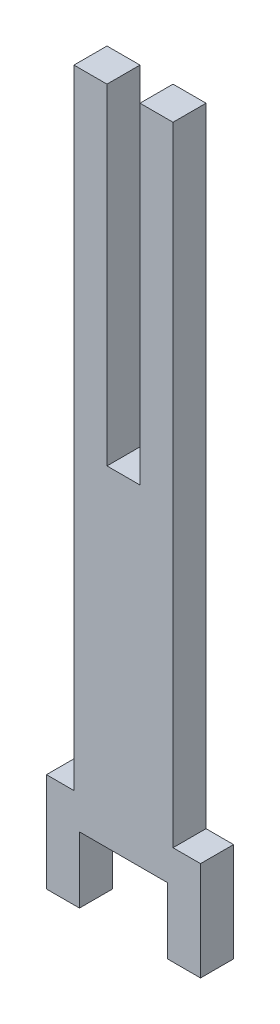
ISO-10303-21;
HEADER;
FILE_DESCRIPTION(('STEP AP214'),'2;1');
FILE_NAME('part.step','',(''),(''),'','','');
FILE_SCHEMA(('AUTOMOTIVE_DESIGN { 1 0 10303 214 1 1 1 1 }'));
ENDSEC;
DATA;
#1=APPLICATION_CONTEXT('core data for automotive mechanical design processes');
#2=APPLICATION_PROTOCOL_DEFINITION('international standard','automotive_design',2000,#1);
#3=PRODUCT_CONTEXT('',#1,'mechanical');
#4=PRODUCT('Part','Part','',(#3));
#5=PRODUCT_RELATED_PRODUCT_CATEGORY('part','',(#4));
#6=PRODUCT_DEFINITION_FORMATION('','',#4);
#7=PRODUCT_DEFINITION_CONTEXT('part definition',#1,'design');
#8=PRODUCT_DEFINITION('design','',#6,#7);
#9=PRODUCT_DEFINITION_SHAPE('','',#8);
#10=(LENGTH_UNIT() NAMED_UNIT(*) SI_UNIT(.MILLI.,.METRE.));
#11=(NAMED_UNIT(*) PLANE_ANGLE_UNIT() SI_UNIT($,.RADIAN.));
#12=(NAMED_UNIT(*) SI_UNIT($,.STERADIAN.) SOLID_ANGLE_UNIT());
#13=UNCERTAINTY_MEASURE_WITH_UNIT(LENGTH_MEASURE(1.E-05),#10,'distance_accuracy_value','');
#14=(GEOMETRIC_REPRESENTATION_CONTEXT(3) GLOBAL_UNCERTAINTY_ASSIGNED_CONTEXT((#13)) GLOBAL_UNIT_ASSIGNED_CONTEXT((#10,
#11,#12)) REPRESENTATION_CONTEXT('',''));
#15=CARTESIAN_POINT('',(0.,0.,0.));
#16=DIRECTION('',(0.,0.,1.));
#17=DIRECTION('',(1.,0.,0.));
#18=AXIS2_PLACEMENT_3D('',#15,#16,#17);
#19=CARTESIAN_POINT('',(0.,33.044,3.));
#20=DIRECTION('',(0.,1.,0.));
#21=DIRECTION('',(0.,0.,1.));
#22=AXIS2_PLACEMENT_3D('',#19,#20,#21);
#23=PLANE('',#22);
#24=DIRECTION('',(0.,0.,1.));
#25=VECTOR('',#24,1.);
#26=CARTESIAN_POINT('',(1.5,33.044,-30.1934088171574));
#27=LINE('',#26,#25);
#28=CARTESIAN_POINT('',(1.5,33.044,0.));
#29=VERTEX_POINT('',#28);
#30=CARTESIAN_POINT('',(1.5,33.044,3.));
#31=VERTEX_POINT('',#30);
#32=EDGE_CURVE('E245',#29,#31,#27,.T.);
#33=ORIENTED_EDGE('',*,*,#32,.T.);
#34=DIRECTION('',(1.,0.,0.));
#35=VECTOR('',#34,1.);
#36=CARTESIAN_POINT('',(0.,33.044,3.));
#37=LINE('',#36,#35);
#38=CARTESIAN_POINT('',(4.5,33.044,3.));
#39=VERTEX_POINT('',#38);
#40=EDGE_CURVE('E75',#31,#39,#37,.T.);
#41=ORIENTED_EDGE('',*,*,#40,.T.);
#42=DIRECTION('',(0.,0.,-1.));
#43=VECTOR('',#42,1.);
#44=CARTESIAN_POINT('',(4.5,33.044,3.));
#45=LINE('',#44,#43);
#46=CARTESIAN_POINT('',(4.5,33.044,0.));
#47=VERTEX_POINT('',#46);
#48=EDGE_CURVE('E191',#39,#47,#45,.T.);
#49=ORIENTED_EDGE('',*,*,#48,.T.);
#50=DIRECTION('',(1.,0.,0.));
#51=VECTOR('',#50,1.);
#52=CARTESIAN_POINT('',(0.,33.044,0.));
#53=LINE('',#52,#51);
#54=EDGE_CURVE('E121',#29,#47,#53,.T.);
#55=ORIENTED_EDGE('',*,*,#54,.F.);
#56=EDGE_LOOP('',(#33,#41,#49,#55));
#57=FACE_BOUND('',#56,.T.);
#58=ADVANCED_FACE('F50',(#57),#23,.T.);
#59=DIRECTION('',(0.,0.,1.));
#60=VECTOR('',#59,1.);
#61=CARTESIAN_POINT('',(-1.5,33.044,-30.1934088171574));
#62=LINE('',#61,#60);
#63=CARTESIAN_POINT('',(-1.5,33.044,0.));
#64=VERTEX_POINT('',#63);
#65=CARTESIAN_POINT('',(-1.5,33.044,3.));
#66=VERTEX_POINT('',#65);
#67=EDGE_CURVE('E249',#64,#66,#62,.T.);
#68=ORIENTED_EDGE('',*,*,#67,.F.);
#69=CARTESIAN_POINT('',(-4.5,33.044,0.));
#70=VERTEX_POINT('',#69);
#71=EDGE_CURVE('E292',#70,#64,#53,.T.);
#72=ORIENTED_EDGE('',*,*,#71,.F.);
#73=DIRECTION('',(0.,0.,-1.));
#74=VECTOR('',#73,1.);
#75=CARTESIAN_POINT('',(-4.5,33.044,3.));
#76=LINE('',#75,#74);
#77=CARTESIAN_POINT('',(-4.5,33.044,3.));
#78=VERTEX_POINT('',#77);
#79=EDGE_CURVE('E12',#78,#70,#76,.T.);
#80=ORIENTED_EDGE('',*,*,#79,.F.);
#81=EDGE_CURVE('E241',#78,#66,#37,.T.);
#82=ORIENTED_EDGE('',*,*,#81,.T.);
#83=EDGE_LOOP('',(#68,#72,#80,#82));
#84=FACE_BOUND('',#83,.T.);
#85=ADVANCED_FACE('F52',(#84),#23,.T.);
#86=CARTESIAN_POINT('',(-4.5,0.,3.));
#87=DIRECTION('',(-1.,0.,0.));
#88=DIRECTION('',(0.,0.,1.));
#89=AXIS2_PLACEMENT_3D('',#86,#87,#88);
#90=PLANE('',#89);
#91=DIRECTION('',(0.,1.,0.));
#92=VECTOR('',#91,1.);
#93=CARTESIAN_POINT('',(-4.5,0.,0.));
#94=LINE('',#93,#92);
#95=CARTESIAN_POINT('',(-4.5,-24.044,0.));
#96=VERTEX_POINT('',#95);
#97=EDGE_CURVE('E297',#96,#70,#94,.T.);
#98=ORIENTED_EDGE('',*,*,#97,.F.);
#99=DIRECTION('',(0.,0.,-1.));
#100=VECTOR('',#99,1.);
#101=CARTESIAN_POINT('',(-4.5,-24.044,3.));
#102=LINE('',#101,#100);
#103=CARTESIAN_POINT('',(-4.5,-24.044,3.));
#104=VERTEX_POINT('',#103);
#105=EDGE_CURVE('E59',#104,#96,#102,.T.);
#106=ORIENTED_EDGE('',*,*,#105,.F.);
#107=DIRECTION('',(0.,1.,0.));
#108=VECTOR('',#107,1.);
#109=CARTESIAN_POINT('',(-4.5,0.,3.));
#110=LINE('',#109,#108);
#111=EDGE_CURVE('E234',#104,#78,#110,.T.);
#112=ORIENTED_EDGE('',*,*,#111,.T.);
#113=ORIENTED_EDGE('',*,*,#79,.T.);
#114=EDGE_LOOP('',(#98,#106,#112,#113));
#115=FACE_BOUND('',#114,.T.);
#116=ADVANCED_FACE('F371',(#115),#90,.T.);
#117=CARTESIAN_POINT('',(0.,-24.044,3.));
#118=DIRECTION('',(0.,-1.,0.));
#119=DIRECTION('',(0.,0.,-1.));
#120=AXIS2_PLACEMENT_3D('',#117,#118,#119);
#121=PLANE('',#120);
#122=DIRECTION('',(-1.,0.,0.));
#123=VECTOR('',#122,1.);
#124=CARTESIAN_POINT('',(0.,-24.044,0.));
#125=LINE('',#124,#123);
#126=CARTESIAN_POINT('',(-7.,-24.044,0.));
#127=VERTEX_POINT('',#126);
#128=EDGE_CURVE('E301',#96,#127,#125,.T.);
#129=ORIENTED_EDGE('',*,*,#128,.T.);
#130=DIRECTION('',(0.,0.,-1.));
#131=VECTOR('',#130,1.);
#132=CARTESIAN_POINT('',(-7.,-24.044,3.));
#133=LINE('',#132,#131);
#134=CARTESIAN_POINT('',(-7.,-24.044,3.));
#135=VERTEX_POINT('',#134);
#136=EDGE_CURVE('E358',#135,#127,#133,.T.);
#137=ORIENTED_EDGE('',*,*,#136,.F.);
#138=DIRECTION('',(-1.,0.,0.));
#139=VECTOR('',#138,1.);
#140=CARTESIAN_POINT('',(0.,-24.044,3.));
#141=LINE('',#140,#139);
#142=EDGE_CURVE('E230',#104,#135,#141,.T.);
#143=ORIENTED_EDGE('',*,*,#142,.F.);
#144=ORIENTED_EDGE('',*,*,#105,.T.);
#145=EDGE_LOOP('',(#129,#137,#143,#144));
#146=FACE_BOUND('',#145,.T.);
#147=ADVANCED_FACE('F364',(#146),#121,.F.);
#148=CARTESIAN_POINT('',(-7.,0.,3.));
#149=DIRECTION('',(1.,0.,0.));
#150=DIRECTION('',(0.,0.,-1.));
#151=AXIS2_PLACEMENT_3D('',#148,#149,#150);
#152=PLANE('',#151);
#153=DIRECTION('',(0.,-1.,0.));
#154=VECTOR('',#153,1.);
#155=CARTESIAN_POINT('',(-7.,0.,0.));
#156=LINE('',#155,#154);
#157=CARTESIAN_POINT('',(-7.,-33.044,0.));
#158=VERTEX_POINT('',#157);
#159=EDGE_CURVE('E306',#127,#158,#156,.T.);
#160=ORIENTED_EDGE('',*,*,#159,.T.);
#161=DIRECTION('',(0.,0.,-1.));
#162=VECTOR('',#161,1.);
#163=CARTESIAN_POINT('',(-7.,-33.044,3.));
#164=LINE('',#163,#162);
#165=CARTESIAN_POINT('',(-7.,-33.044,3.));
#166=VERTEX_POINT('',#165);
#167=EDGE_CURVE('E354',#166,#158,#164,.T.);
#168=ORIENTED_EDGE('',*,*,#167,.F.);
#169=DIRECTION('',(0.,-1.,0.));
#170=VECTOR('',#169,1.);
#171=CARTESIAN_POINT('',(-7.,0.,3.));
#172=LINE('',#171,#170);
#173=EDGE_CURVE('E226',#135,#166,#172,.T.);
#174=ORIENTED_EDGE('',*,*,#173,.F.);
#175=ORIENTED_EDGE('',*,*,#136,.T.);
#176=EDGE_LOOP('',(#160,#168,#174,#175));
#177=FACE_BOUND('',#176,.T.);
#178=ADVANCED_FACE('F428',(#177),#152,.F.);
#179=CARTESIAN_POINT('',(0.,-33.044,3.));
#180=DIRECTION('',(0.,1.,0.));
#181=DIRECTION('',(0.,0.,1.));
#182=AXIS2_PLACEMENT_3D('',#179,#180,#181);
#183=PLANE('',#182);
#184=DIRECTION('',(1.,0.,0.));
#185=VECTOR('',#184,1.);
#186=CARTESIAN_POINT('',(0.,-33.044,0.));
#187=LINE('',#186,#185);
#188=CARTESIAN_POINT('',(-4.,-33.044,0.));
#189=VERTEX_POINT('',#188);
#190=EDGE_CURVE('E309',#158,#189,#187,.T.);
#191=ORIENTED_EDGE('',*,*,#190,.T.);
#192=DIRECTION('',(0.,0.,-1.));
#193=VECTOR('',#192,1.);
#194=CARTESIAN_POINT('',(-4.,-33.044,3.));
#195=LINE('',#194,#193);
#196=CARTESIAN_POINT('',(-4.,-33.044,3.));
#197=VERTEX_POINT('',#196);
#198=EDGE_CURVE('E350',#197,#189,#195,.T.);
#199=ORIENTED_EDGE('',*,*,#198,.F.);
#200=DIRECTION('',(1.,0.,0.));
#201=VECTOR('',#200,1.);
#202=CARTESIAN_POINT('',(0.,-33.044,3.));
#203=LINE('',#202,#201);
#204=EDGE_CURVE('E223',#166,#197,#203,.T.);
#205=ORIENTED_EDGE('',*,*,#204,.F.);
#206=ORIENTED_EDGE('',*,*,#167,.T.);
#207=EDGE_LOOP('',(#191,#199,#205,#206));
#208=FACE_BOUND('',#207,.T.);
#209=ADVANCED_FACE('F433',(#208),#183,.F.);
#210=CARTESIAN_POINT('',(-4.,0.,3.));
#211=DIRECTION('',(-1.,0.,0.));
#212=DIRECTION('',(0.,0.,1.));
#213=AXIS2_PLACEMENT_3D('',#210,#211,#212);
#214=PLANE('',#213);
#215=DIRECTION('',(0.,1.,0.));
#216=VECTOR('',#215,1.);
#217=CARTESIAN_POINT('',(-4.,0.,0.));
#218=LINE('',#217,#216);
#219=CARTESIAN_POINT('',(-4.,-27.044,0.));
#220=VERTEX_POINT('',#219);
#221=EDGE_CURVE('E312',#189,#220,#218,.T.);
#222=ORIENTED_EDGE('',*,*,#221,.T.);
#223=DIRECTION('',(0.,0.,-1.));
#224=VECTOR('',#223,1.);
#225=CARTESIAN_POINT('',(-4.,-27.044,3.));
#226=LINE('',#225,#224);
#227=CARTESIAN_POINT('',(-4.,-27.044,3.));
#228=VERTEX_POINT('',#227);
#229=EDGE_CURVE('E346',#228,#220,#226,.T.);
#230=ORIENTED_EDGE('',*,*,#229,.F.);
#231=DIRECTION('',(0.,1.,0.));
#232=VECTOR('',#231,1.);
#233=CARTESIAN_POINT('',(-4.,0.,3.));
#234=LINE('',#233,#232);
#235=EDGE_CURVE('E215',#197,#228,#234,.T.);
#236=ORIENTED_EDGE('',*,*,#235,.F.);
#237=ORIENTED_EDGE('',*,*,#198,.T.);
#238=EDGE_LOOP('',(#222,#230,#236,#237));
#239=FACE_BOUND('',#238,.T.);
#240=ADVANCED_FACE('F382',(#239),#214,.F.);
#241=CARTESIAN_POINT('',(0.,-27.044,3.));
#242=DIRECTION('',(0.,1.,0.));
#243=DIRECTION('',(0.,0.,1.));
#244=AXIS2_PLACEMENT_3D('',#241,#242,#243);
#245=PLANE('',#244);
#246=DIRECTION('',(1.,0.,0.));
#247=VECTOR('',#246,1.);
#248=CARTESIAN_POINT('',(0.,-27.044,0.));
#249=LINE('',#248,#247);
#250=CARTESIAN_POINT('',(4.,-27.044,0.));
#251=VERTEX_POINT('',#250);
#252=EDGE_CURVE('E315',#220,#251,#249,.T.);
#253=ORIENTED_EDGE('',*,*,#252,.T.);
#254=DIRECTION('',(0.,0.,-1.));
#255=VECTOR('',#254,1.);
#256=CARTESIAN_POINT('',(4.,-27.044,3.));
#257=LINE('',#256,#255);
#258=CARTESIAN_POINT('',(4.,-27.044,3.));
#259=VERTEX_POINT('',#258);
#260=EDGE_CURVE('E343',#259,#251,#257,.T.);
#261=ORIENTED_EDGE('',*,*,#260,.F.);
#262=DIRECTION('',(1.,0.,0.));
#263=VECTOR('',#262,1.);
#264=CARTESIAN_POINT('',(0.,-27.044,3.));
#265=LINE('',#264,#263);
#266=EDGE_CURVE('E211',#228,#259,#265,.T.);
#267=ORIENTED_EDGE('',*,*,#266,.F.);
#268=ORIENTED_EDGE('',*,*,#229,.T.);
#269=EDGE_LOOP('',(#253,#261,#267,#268));
#270=FACE_BOUND('',#269,.T.);
#271=ADVANCED_FACE('F386',(#270),#245,.F.);
#272=CARTESIAN_POINT('',(4.,0.,3.));
#273=DIRECTION('',(-1.,0.,0.));
#274=DIRECTION('',(0.,0.,1.));
#275=AXIS2_PLACEMENT_3D('',#272,#273,#274);
#276=PLANE('',#275);
#277=DIRECTION('',(0.,1.,0.));
#278=VECTOR('',#277,1.);
#279=CARTESIAN_POINT('',(4.,0.,0.));
#280=LINE('',#279,#278);
#281=CARTESIAN_POINT('',(4.,-33.044,0.));
#282=VERTEX_POINT('',#281);
#283=EDGE_CURVE('E319',#282,#251,#280,.T.);
#284=ORIENTED_EDGE('',*,*,#283,.F.);
#285=DIRECTION('',(0.,0.,-1.));
#286=VECTOR('',#285,1.);
#287=CARTESIAN_POINT('',(4.,-33.044,3.));
#288=LINE('',#287,#286);
#289=CARTESIAN_POINT('',(4.,-33.044,3.));
#290=VERTEX_POINT('',#289);
#291=EDGE_CURVE('E340',#290,#282,#288,.T.);
#292=ORIENTED_EDGE('',*,*,#291,.F.);
#293=DIRECTION('',(0.,1.,0.));
#294=VECTOR('',#293,1.);
#295=CARTESIAN_POINT('',(4.,0.,3.));
#296=LINE('',#295,#294);
#297=EDGE_CURVE('E206',#290,#259,#296,.T.);
#298=ORIENTED_EDGE('',*,*,#297,.T.);
#299=ORIENTED_EDGE('',*,*,#260,.T.);
#300=EDGE_LOOP('',(#284,#292,#298,#299));
#301=FACE_BOUND('',#300,.T.);
#302=ADVANCED_FACE('F389',(#301),#276,.T.);
#303=CARTESIAN_POINT('',(0.,-33.044,3.));
#304=DIRECTION('',(0.,1.,0.));
#305=DIRECTION('',(0.,0.,1.));
#306=AXIS2_PLACEMENT_3D('',#303,#304,#305);
#307=PLANE('',#306);
#308=DIRECTION('',(1.,0.,0.));
#309=VECTOR('',#308,1.);
#310=CARTESIAN_POINT('',(0.,-33.044,0.));
#311=LINE('',#310,#309);
#312=CARTESIAN_POINT('',(7.,-33.044,0.));
#313=VERTEX_POINT('',#312);
#314=EDGE_CURVE('E323',#282,#313,#311,.T.);
#315=ORIENTED_EDGE('',*,*,#314,.T.);
#316=DIRECTION('',(0.,0.,-1.));
#317=VECTOR('',#316,1.);
#318=CARTESIAN_POINT('',(7.,-33.044,3.));
#319=LINE('',#318,#317);
#320=CARTESIAN_POINT('',(7.,-33.044,3.));
#321=VERTEX_POINT('',#320);
#322=EDGE_CURVE('E182',#321,#313,#319,.T.);
#323=ORIENTED_EDGE('',*,*,#322,.F.);
#324=DIRECTION('',(1.,0.,0.));
#325=VECTOR('',#324,1.);
#326=CARTESIAN_POINT('',(0.,-33.044,3.));
#327=LINE('',#326,#325);
#328=EDGE_CURVE('E167',#290,#321,#327,.T.);
#329=ORIENTED_EDGE('',*,*,#328,.F.);
#330=ORIENTED_EDGE('',*,*,#291,.T.);
#331=EDGE_LOOP('',(#315,#323,#329,#330));
#332=FACE_BOUND('',#331,.T.);
#333=ADVANCED_FACE('F392',(#332),#307,.F.);
#334=CARTESIAN_POINT('',(7.,0.,3.));
#335=DIRECTION('',(-1.,0.,0.));
#336=DIRECTION('',(0.,0.,1.));
#337=AXIS2_PLACEMENT_3D('',#334,#335,#336);
#338=PLANE('',#337);
#339=DIRECTION('',(0.,1.,0.));
#340=VECTOR('',#339,1.);
#341=CARTESIAN_POINT('',(7.,0.,0.));
#342=LINE('',#341,#340);
#343=CARTESIAN_POINT('',(7.,-24.044,0.));
#344=VERTEX_POINT('',#343);
#345=EDGE_CURVE('E177',#313,#344,#342,.T.);
#346=ORIENTED_EDGE('',*,*,#345,.T.);
#347=DIRECTION('',(0.,0.,-1.));
#348=VECTOR('',#347,1.);
#349=CARTESIAN_POINT('',(7.,-24.044,3.));
#350=LINE('',#349,#348);
#351=CARTESIAN_POINT('',(7.,-24.044,3.));
#352=VERTEX_POINT('',#351);
#353=EDGE_CURVE('E174',#352,#344,#350,.T.);
#354=ORIENTED_EDGE('',*,*,#353,.F.);
#355=DIRECTION('',(0.,1.,0.));
#356=VECTOR('',#355,1.);
#357=CARTESIAN_POINT('',(7.,0.,3.));
#358=LINE('',#357,#356);
#359=EDGE_CURVE('E157',#321,#352,#358,.T.);
#360=ORIENTED_EDGE('',*,*,#359,.F.);
#361=ORIENTED_EDGE('',*,*,#322,.T.);
#362=EDGE_LOOP('',(#346,#354,#360,#361));
#363=FACE_BOUND('',#362,.T.);
#364=ADVANCED_FACE('F175',(#363),#338,.F.);
#365=CARTESIAN_POINT('',(0.,-24.044,3.));
#366=DIRECTION('',(0.,-1.,0.));
#367=DIRECTION('',(0.,0.,-1.));
#368=AXIS2_PLACEMENT_3D('',#365,#366,#367);
#369=PLANE('',#368);
#370=DIRECTION('',(-1.,0.,0.));
#371=VECTOR('',#370,1.);
#372=CARTESIAN_POINT('',(0.,-24.044,0.));
#373=LINE('',#372,#371);
#374=CARTESIAN_POINT('',(4.50000000000001,-24.044,0.));
#375=VERTEX_POINT('',#374);
#376=EDGE_CURVE('E328',#344,#375,#373,.T.);
#377=ORIENTED_EDGE('',*,*,#376,.T.);
#378=DIRECTION('',(0.,0.,-1.));
#379=VECTOR('',#378,1.);
#380=CARTESIAN_POINT('',(4.50000000000001,-24.044,3.));
#381=LINE('',#380,#379);
#382=CARTESIAN_POINT('',(4.50000000000001,-24.044,3.));
#383=VERTEX_POINT('',#382);
#384=EDGE_CURVE('E183',#383,#375,#381,.T.);
#385=ORIENTED_EDGE('',*,*,#384,.F.);
#386=DIRECTION('',(-1.,0.,0.));
#387=VECTOR('',#386,1.);
#388=CARTESIAN_POINT('',(0.,-24.044,3.));
#389=LINE('',#388,#387);
#390=EDGE_CURVE('E163',#352,#383,#389,.T.);
#391=ORIENTED_EDGE('',*,*,#390,.F.);
#392=ORIENTED_EDGE('',*,*,#353,.T.);
#393=EDGE_LOOP('',(#377,#385,#391,#392));
#394=FACE_BOUND('',#393,.T.);
#395=ADVANCED_FACE('F185',(#394),#369,.F.);
#396=CARTESIAN_POINT('',(4.5,0.,3.));
#397=DIRECTION('',(1.,0.,0.));
#398=DIRECTION('',(0.,1.,0.));
#399=AXIS2_PLACEMENT_3D('',#396,#397,#398);
#400=PLANE('',#399);
#401=DIRECTION('',(0.,-1.,0.));
#402=VECTOR('',#401,1.);
#403=CARTESIAN_POINT('',(4.5,0.,0.));
#404=LINE('',#403,#402);
#405=EDGE_CURVE('E331',#47,#375,#404,.T.);
#406=ORIENTED_EDGE('',*,*,#405,.F.);
#407=ORIENTED_EDGE('',*,*,#48,.F.);
#408=DIRECTION('',(0.,-1.,0.));
#409=VECTOR('',#408,1.);
#410=CARTESIAN_POINT('',(4.5,0.,3.));
#411=LINE('',#410,#409);
#412=EDGE_CURVE('E188',#39,#383,#411,.T.);
#413=ORIENTED_EDGE('',*,*,#412,.T.);
#414=ORIENTED_EDGE('',*,*,#384,.T.);
#415=EDGE_LOOP('',(#406,#407,#413,#414));
#416=FACE_BOUND('',#415,.T.);
#417=ADVANCED_FACE('F395',(#416),#400,.T.);
#418=CARTESIAN_POINT('',(0.,0.,3.));
#419=DIRECTION('',(0.,0.,1.));
#420=DIRECTION('',(1.,0.,0.));
#421=AXIS2_PLACEMENT_3D('',#418,#419,#420);
#422=PLANE('',#421);
#423=DIRECTION('',(0.,1.,0.));
#424=VECTOR('',#423,1.);
#425=CARTESIAN_POINT('',(1.5,33.044,3.));
#426=LINE('',#425,#424);
#427=CARTESIAN_POINT('',(1.5,3.,3.));
#428=VERTEX_POINT('',#427);
#429=EDGE_CURVE('E268',#428,#31,#426,.T.);
#430=ORIENTED_EDGE('',*,*,#429,.F.);
#431=DIRECTION('',(1.,0.,0.));
#432=VECTOR('',#431,1.);
#433=CARTESIAN_POINT('',(-1.5,3.,3.));
#434=LINE('',#433,#432);
#435=CARTESIAN_POINT('',(-1.5,3.,3.));
#436=VERTEX_POINT('',#435);
#437=EDGE_CURVE('E250',#436,#428,#434,.T.);
#438=ORIENTED_EDGE('',*,*,#437,.F.);
#439=DIRECTION('',(0.,-1.,0.));
#440=VECTOR('',#439,1.);
#441=CARTESIAN_POINT('',(-1.5,33.044,3.));
#442=LINE('',#441,#440);
#443=EDGE_CURVE('E264',#66,#436,#442,.T.);
#444=ORIENTED_EDGE('',*,*,#443,.F.);
#445=ORIENTED_EDGE('',*,*,#81,.F.);
#446=ORIENTED_EDGE('',*,*,#111,.F.);
#447=ORIENTED_EDGE('',*,*,#142,.T.);
#448=ORIENTED_EDGE('',*,*,#173,.T.);
#449=ORIENTED_EDGE('',*,*,#204,.T.);
#450=ORIENTED_EDGE('',*,*,#235,.T.);
#451=ORIENTED_EDGE('',*,*,#266,.T.);
#452=ORIENTED_EDGE('',*,*,#297,.F.);
#453=ORIENTED_EDGE('',*,*,#328,.T.);
#454=ORIENTED_EDGE('',*,*,#359,.T.);
#455=ORIENTED_EDGE('',*,*,#390,.T.);
#456=ORIENTED_EDGE('',*,*,#412,.F.);
#457=ORIENTED_EDGE('',*,*,#40,.F.);
#458=EDGE_LOOP('',(#430,#438,#444,#445,#446,#447,#448,#449,#450,#451,#452,#453,#454,#455,#456,#457));
#459=FACE_BOUND('',#458,.T.);
#460=ADVANCED_FACE('F160',(#459),#422,.T.);
#461=CARTESIAN_POINT('',(0.,0.,0.));
#462=DIRECTION('',(0.,0.,1.));
#463=DIRECTION('',(1.,0.,0.));
#464=AXIS2_PLACEMENT_3D('',#461,#462,#463);
#465=PLANE('',#464);
#466=DIRECTION('',(-1.,0.,0.));
#467=VECTOR('',#466,1.);
#468=CARTESIAN_POINT('',(-1.5,3.,0.));
#469=LINE('',#468,#467);
#470=CARTESIAN_POINT('',(1.5,3.,0.));
#471=VERTEX_POINT('',#470);
#472=CARTESIAN_POINT('',(-1.5,3.,0.));
#473=VERTEX_POINT('',#472);
#474=EDGE_CURVE('E277',#471,#473,#469,.T.);
#475=ORIENTED_EDGE('',*,*,#474,.F.);
#476=DIRECTION('',(0.,-1.,0.));
#477=VECTOR('',#476,1.);
#478=CARTESIAN_POINT('',(1.5,33.044,0.));
#479=LINE('',#478,#477);
#480=EDGE_CURVE('E273',#29,#471,#479,.T.);
#481=ORIENTED_EDGE('',*,*,#480,.F.);
#482=ORIENTED_EDGE('',*,*,#54,.T.);
#483=ORIENTED_EDGE('',*,*,#405,.T.);
#484=ORIENTED_EDGE('',*,*,#376,.F.);
#485=ORIENTED_EDGE('',*,*,#345,.F.);
#486=ORIENTED_EDGE('',*,*,#314,.F.);
#487=ORIENTED_EDGE('',*,*,#283,.T.);
#488=ORIENTED_EDGE('',*,*,#252,.F.);
#489=ORIENTED_EDGE('',*,*,#221,.F.);
#490=ORIENTED_EDGE('',*,*,#190,.F.);
#491=ORIENTED_EDGE('',*,*,#159,.F.);
#492=ORIENTED_EDGE('',*,*,#128,.F.);
#493=ORIENTED_EDGE('',*,*,#97,.T.);
#494=ORIENTED_EDGE('',*,*,#71,.T.);
#495=DIRECTION('',(0.,1.,0.));
#496=VECTOR('',#495,1.);
#497=CARTESIAN_POINT('',(-1.5,33.044,0.));
#498=LINE('',#497,#496);
#499=EDGE_CURVE('E260',#473,#64,#498,.T.);
#500=ORIENTED_EDGE('',*,*,#499,.F.);
#501=EDGE_LOOP('',(#475,#481,#482,#483,#484,#485,#486,#487,#488,#489,#490,#491,#492,#493,#494,#500));
#502=FACE_BOUND('',#501,.T.);
#503=ADVANCED_FACE('F294',(#502),#465,.F.);
#504=CARTESIAN_POINT('',(1.5,33.044,-30.1934088171574));
#505=DIRECTION('',(1.,0.,0.));
#506=DIRECTION('',(0.,1.,0.));
#507=AXIS2_PLACEMENT_3D('',#504,#505,#506);
#508=PLANE('',#507);
#509=ORIENTED_EDGE('',*,*,#480,.T.);
#510=DIRECTION('',(0.,0.,1.));
#511=VECTOR('',#510,1.);
#512=CARTESIAN_POINT('',(1.5,3.,-30.1934088171574));
#513=LINE('',#512,#511);
#514=EDGE_CURVE('E256',#471,#428,#513,.T.);
#515=ORIENTED_EDGE('',*,*,#514,.T.);
#516=ORIENTED_EDGE('',*,*,#429,.T.);
#517=ORIENTED_EDGE('',*,*,#32,.F.);
#518=EDGE_LOOP('',(#509,#515,#516,#517));
#519=FACE_BOUND('',#518,.T.);
#520=ADVANCED_FACE('F406',(#519),#508,.F.);
#521=CARTESIAN_POINT('',(-1.5,3.,-30.1934088171574));
#522=DIRECTION('',(0.,-1.,0.));
#523=DIRECTION('',(0.,0.,-1.));
#524=AXIS2_PLACEMENT_3D('',#521,#522,#523);
#525=PLANE('',#524);
#526=ORIENTED_EDGE('',*,*,#474,.T.);
#527=DIRECTION('',(0.,0.,1.));
#528=VECTOR('',#527,1.);
#529=CARTESIAN_POINT('',(-1.5,3.,-30.1934088171574));
#530=LINE('',#529,#528);
#531=EDGE_CURVE('E66',#473,#436,#530,.T.);
#532=ORIENTED_EDGE('',*,*,#531,.T.);
#533=ORIENTED_EDGE('',*,*,#437,.T.);
#534=ORIENTED_EDGE('',*,*,#514,.F.);
#535=EDGE_LOOP('',(#526,#532,#533,#534));
#536=FACE_BOUND('',#535,.T.);
#537=ADVANCED_FACE('F408',(#536),#525,.F.);
#538=CARTESIAN_POINT('',(-1.5,33.044,-30.1934088171574));
#539=DIRECTION('',(-1.,0.,0.));
#540=DIRECTION('',(0.,-1.,0.));
#541=AXIS2_PLACEMENT_3D('',#538,#539,#540);
#542=PLANE('',#541);
#543=ORIENTED_EDGE('',*,*,#499,.T.);
#544=ORIENTED_EDGE('',*,*,#67,.T.);
#545=ORIENTED_EDGE('',*,*,#443,.T.);
#546=ORIENTED_EDGE('',*,*,#531,.F.);
#547=EDGE_LOOP('',(#543,#544,#545,#546));
#548=FACE_BOUND('',#547,.T.);
#549=ADVANCED_FACE('F284',(#548),#542,.F.);
#550=CLOSED_SHELL('',(#58,#85,#116,#147,#178,#209,#240,#271,#302,#333,#364,#395,#417,#460,#503,
#520,#537,#549));
#551=MANIFOLD_SOLID_BREP('B2',#550);
#552=ADVANCED_BREP_SHAPE_REPRESENTATION('',(#18,#551),#14);
#553=SHAPE_DEFINITION_REPRESENTATION(#9,#552);
ENDSEC;
END-ISO-10303-21;
